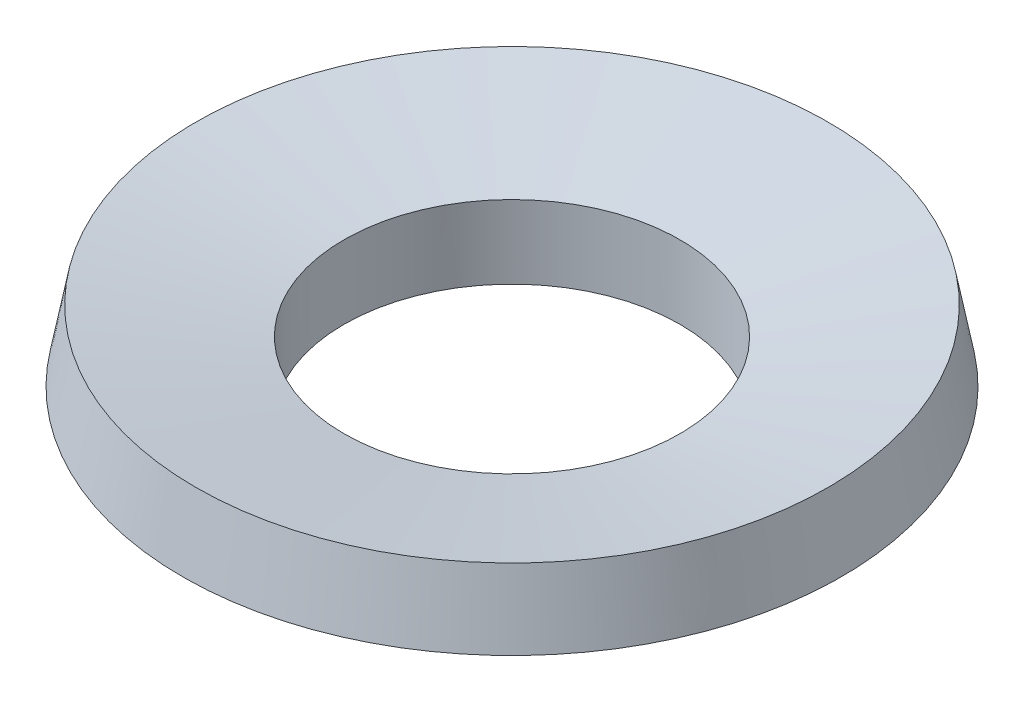
ISO-10303-21;
HEADER;
FILE_DESCRIPTION(('STEP AP214'),'2;1');
FILE_NAME('part.step','',(''),(''),'','','');
FILE_SCHEMA(('AUTOMOTIVE_DESIGN { 1 0 10303 214 1 1 1 1 }'));
ENDSEC;
DATA;
#1=APPLICATION_CONTEXT('core data for automotive mechanical design processes');
#2=APPLICATION_PROTOCOL_DEFINITION('international standard','automotive_design',2000,#1);
#3=PRODUCT_CONTEXT('',#1,'mechanical');
#4=PRODUCT('Part','Part','',(#3));
#5=PRODUCT_RELATED_PRODUCT_CATEGORY('part','',(#4));
#6=PRODUCT_DEFINITION_FORMATION('','',#4);
#7=PRODUCT_DEFINITION_CONTEXT('part definition',#1,'design');
#8=PRODUCT_DEFINITION('design','',#6,#7);
#9=PRODUCT_DEFINITION_SHAPE('','',#8);
#10=(LENGTH_UNIT() NAMED_UNIT(*) SI_UNIT(.MILLI.,.METRE.));
#11=(NAMED_UNIT(*) PLANE_ANGLE_UNIT() SI_UNIT($,.RADIAN.));
#12=(NAMED_UNIT(*) SI_UNIT($,.STERADIAN.) SOLID_ANGLE_UNIT());
#13=UNCERTAINTY_MEASURE_WITH_UNIT(LENGTH_MEASURE(1.E-05),#10,'distance_accuracy_value','');
#14=(GEOMETRIC_REPRESENTATION_CONTEXT(3) GLOBAL_UNCERTAINTY_ASSIGNED_CONTEXT((#13)) GLOBAL_UNIT_ASSIGNED_CONTEXT((#10,
#11,#12)) REPRESENTATION_CONTEXT('',''));
#15=CARTESIAN_POINT('',(0.,0.,0.));
#16=DIRECTION('',(0.,0.,1.));
#17=DIRECTION('',(1.,0.,0.));
#18=AXIS2_PLACEMENT_3D('',#15,#16,#17);
#19=CARTESIAN_POINT('',(36.8577939001171,-66.137142629799,10.4000283791901));
#20=DIRECTION('',(0.,1.,0.));
#21=DIRECTION('',(0.,0.,1.));
#22=AXIS2_PLACEMENT_3D('',#19,#20,#21);
#23=CONICAL_SURFACE('',#22,8.00000000008659,1.38627756728708);
#24=CARTESIAN_POINT('',(36.8577939001171,-66.8371426298124,10.4000283791901));
#25=DIRECTION('',(0.,1.,0.));
#26=DIRECTION('',(0.,0.,1.));
#27=AXIS2_PLACEMENT_3D('',#24,#25,#26);
#28=CIRCLE('',#27,4.24950020941952);
#29=CARTESIAN_POINT('',(36.8577939001171,-66.8371426298124,14.6495285886096));
#30=VERTEX_POINT('',#29);
#31=EDGE_CURVE('E26',#30,#30,#28,.F.);
#32=ORIENTED_EDGE('',*,*,#31,.T.);
#33=EDGE_LOOP('',(#32));
#34=FACE_BOUND('',#33,.T.);
#35=CARTESIAN_POINT('',(36.8577939001171,-66.1371426298124,10.4000283791901));
#36=DIRECTION('',(0.,-1.,0.));
#37=DIRECTION('',(-0.443136015971368,0.,0.896454388883798));
#38=AXIS2_PLACEMENT_3D('',#35,#36,#37);
#39=CIRCLE('',#38,8.);
#40=CARTESIAN_POINT('',(33.3127057723461,-66.1371426298124,17.5716634902605));
#41=VERTEX_POINT('',#40);
#42=EDGE_CURVE('E17',#41,#41,#39,.T.);
#43=ORIENTED_EDGE('',*,*,#42,.F.);
#44=EDGE_LOOP('',(#43));
#45=FACE_BOUND('',#44,.T.);
#46=ADVANCED_FACE('F14',(#34,#45),#23,.F.);
#47=CARTESIAN_POINT('',(36.8577939001171,-67.9281842454659,10.4000283791901));
#48=DIRECTION('',(0.,-1.,0.));
#49=DIRECTION('',(0.,0.,-1.));
#50=AXIS2_PLACEMENT_3D('',#47,#48,#49);
#51=CONICAL_SURFACE('',#50,8.334283215828,0.184518759509496);
#52=CARTESIAN_POINT('',(36.8577939001171,-67.9281842454659,10.4000283791901));
#53=DIRECTION('',(0.,1.,0.));
#54=DIRECTION('',(0.443136015971368,0.,-0.896454388883798));
#55=AXIS2_PLACEMENT_3D('',#52,#53,#54);
#56=CIRCLE('',#55,8.33428321582801);
#57=CARTESIAN_POINT('',(40.5510149603561,-67.9281842454659,2.92872361216052));
#58=VERTEX_POINT('',#57);
#59=EDGE_CURVE('E21',#58,#58,#56,.F.);
#60=ORIENTED_EDGE('',*,*,#59,.F.);
#61=EDGE_LOOP('',(#60));
#62=FACE_BOUND('',#61,.T.);
#63=ORIENTED_EDGE('',*,*,#42,.T.);
#64=EDGE_LOOP('',(#63));
#65=FACE_BOUND('',#64,.T.);
#66=ADVANCED_FACE('F34',(#62,#65),#51,.T.);
#67=CARTESIAN_POINT('',(36.8577939001171,-68.7371426298124,10.4000283791901));
#68=DIRECTION('',(0.,1.,0.));
#69=DIRECTION('',(0.,0.,1.));
#70=AXIS2_PLACEMENT_3D('',#67,#68,#69);
#71=CYLINDRICAL_SURFACE('',#70,4.24950020941952);
#72=CARTESIAN_POINT('',(36.8577939001171,-68.6905754637423,10.4000283791901));
#73=DIRECTION('',(0.,1.,0.));
#74=DIRECTION('',(0.443136015971369,0.,-0.896454388883797));
#75=AXIS2_PLACEMENT_3D('',#72,#73,#74);
#76=CIRCLE('',#75,4.24950020941952);
#77=CARTESIAN_POINT('',(38.7409004927887,-68.6905754637423,6.59054526589336));
#78=VERTEX_POINT('',#77);
#79=EDGE_CURVE('E10',#78,#78,#76,.T.);
#80=ORIENTED_EDGE('',*,*,#79,.F.);
#81=EDGE_LOOP('',(#80));
#82=FACE_BOUND('',#81,.T.);
#83=ORIENTED_EDGE('',*,*,#31,.F.);
#84=EDGE_LOOP('',(#83));
#85=FACE_BOUND('',#84,.T.);
#86=ADVANCED_FACE('F41',(#82,#85),#71,.F.);
#87=CARTESIAN_POINT('',(36.8577939001171,-67.9281842454659,10.4000283791901));
#88=DIRECTION('',(0.,1.,0.));
#89=DIRECTION('',(0.,0.,1.));
#90=AXIS2_PLACEMENT_3D('',#87,#88,#89);
#91=CONICAL_SURFACE('',#90,8.334283215828,1.3862775672854);
#92=ORIENTED_EDGE('',*,*,#59,.T.);
#93=EDGE_LOOP('',(#92));
#94=FACE_BOUND('',#93,.T.);
#95=ORIENTED_EDGE('',*,*,#79,.T.);
#96=EDGE_LOOP('',(#95));
#97=FACE_BOUND('',#96,.T.);
#98=ADVANCED_FACE('F43',(#94,#97),#91,.T.);
#99=CLOSED_SHELL('',(#46,#66,#86,#98));
#100=MANIFOLD_SOLID_BREP('B1',#99);
#101=ADVANCED_BREP_SHAPE_REPRESENTATION('',(#18,#100),#14);
#102=SHAPE_DEFINITION_REPRESENTATION(#9,#101);
ENDSEC;
END-ISO-10303-21;
